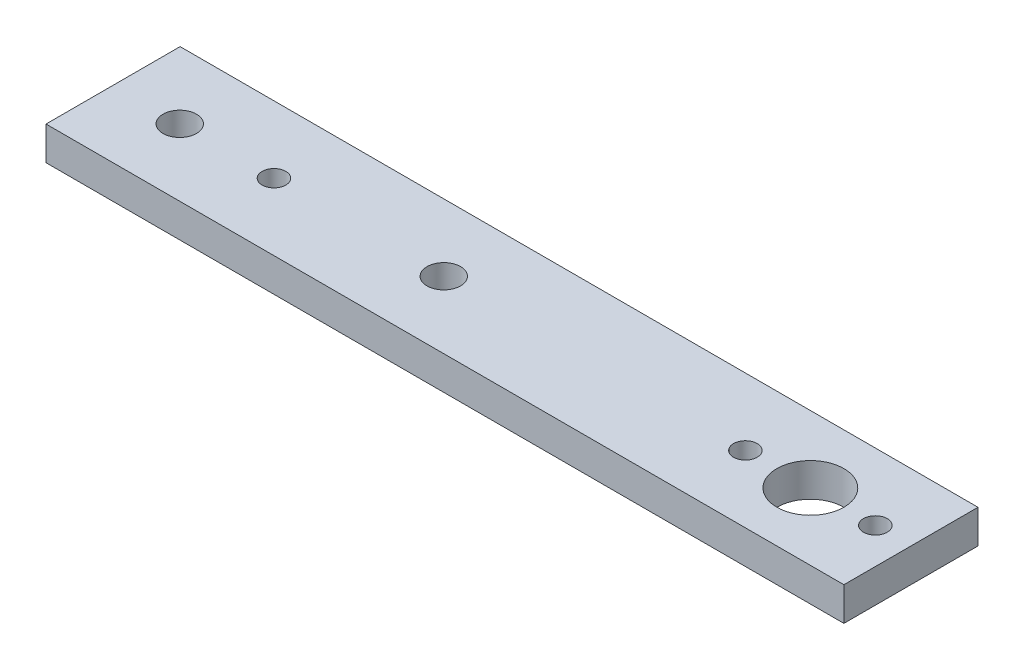
ISO-10303-21;
HEADER;
FILE_DESCRIPTION(('STEP AP214'),'2;1');
FILE_NAME('part.step','',(''),(''),'','','');
FILE_SCHEMA(('AUTOMOTIVE_DESIGN { 1 0 10303 214 1 1 1 1 }'));
ENDSEC;
DATA;
#1=APPLICATION_CONTEXT('core data for automotive mechanical design processes');
#2=APPLICATION_PROTOCOL_DEFINITION('international standard','automotive_design',2000,#1);
#3=PRODUCT_CONTEXT('',#1,'mechanical');
#4=PRODUCT('Part','Part','',(#3));
#5=PRODUCT_RELATED_PRODUCT_CATEGORY('part','',(#4));
#6=PRODUCT_DEFINITION_FORMATION('','',#4);
#7=PRODUCT_DEFINITION_CONTEXT('part definition',#1,'design');
#8=PRODUCT_DEFINITION('design','',#6,#7);
#9=PRODUCT_DEFINITION_SHAPE('','',#8);
#10=(LENGTH_UNIT() NAMED_UNIT(*) SI_UNIT(.MILLI.,.METRE.));
#11=(NAMED_UNIT(*) PLANE_ANGLE_UNIT() SI_UNIT($,.RADIAN.));
#12=(NAMED_UNIT(*) SI_UNIT($,.STERADIAN.) SOLID_ANGLE_UNIT());
#13=UNCERTAINTY_MEASURE_WITH_UNIT(LENGTH_MEASURE(1.E-05),#10,'distance_accuracy_value','');
#14=(GEOMETRIC_REPRESENTATION_CONTEXT(3) GLOBAL_UNCERTAINTY_ASSIGNED_CONTEXT((#13)) GLOBAL_UNIT_ASSIGNED_CONTEXT((#10,
#11,#12)) REPRESENTATION_CONTEXT('',''));
#15=CARTESIAN_POINT('',(0.,0.,0.));
#16=DIRECTION('',(0.,0.,1.));
#17=DIRECTION('',(1.,0.,0.));
#18=AXIS2_PLACEMENT_3D('',#15,#16,#17);
#19=CARTESIAN_POINT('',(0.,6.35,0.));
#20=DIRECTION('',(0.,1.,0.));
#21=DIRECTION('',(0.,0.,1.));
#22=AXIS2_PLACEMENT_3D('',#19,#20,#21);
#23=PLANE('',#22);
#24=CARTESIAN_POINT('',(28.1813,6.35,0.));
#25=DIRECTION('',(0.,-1.,0.));
#26=DIRECTION('',(0.,0.,-1.));
#27=AXIS2_PLACEMENT_3D('',#24,#25,#26);
#28=CIRCLE('',#27,2.2479);
#29=CARTESIAN_POINT('',(28.1813,6.35,-2.24789999999998));
#30=VERTEX_POINT('',#29);
#31=EDGE_CURVE('E312',#30,#30,#28,.T.);
#32=ORIENTED_EDGE('',*,*,#31,.T.);
#33=EDGE_LOOP('',(#32));
#34=FACE_BOUND('',#33,.T.);
#35=CARTESIAN_POINT('',(3.56869999999998,6.35,0.));
#36=DIRECTION('',(0.,-1.,0.));
#37=DIRECTION('',(0.,0.,-1.));
#38=AXIS2_PLACEMENT_3D('',#35,#36,#37);
#39=CIRCLE('',#38,2.2479);
#40=CARTESIAN_POINT('',(3.56869999999998,6.35,-2.24789999999998));
#41=VERTEX_POINT('',#40);
#42=EDGE_CURVE('E325',#41,#41,#39,.T.);
#43=ORIENTED_EDGE('',*,*,#42,.T.);
#44=EDGE_LOOP('',(#43));
#45=FACE_BOUND('',#44,.T.);
#46=CARTESIAN_POINT('',(-53.55992209,6.35,0.));
#47=DIRECTION('',(0.,-1.,0.));
#48=DIRECTION('',(0.,0.,-1.));
#49=AXIS2_PLACEMENT_3D('',#46,#47,#48);
#50=CIRCLE('',#49,3.17500000000001);
#51=CARTESIAN_POINT('',(-53.55992209,6.35,-3.17499999999999));
#52=VERTEX_POINT('',#51);
#53=EDGE_CURVE('E113',#52,#52,#50,.T.);
#54=ORIENTED_EDGE('',*,*,#53,.T.);
#55=EDGE_LOOP('',(#54));
#56=FACE_BOUND('',#55,.T.);
#57=CARTESIAN_POINT('',(-85.725,6.35,0.));
#58=DIRECTION('',(0.,-1.,0.));
#59=DIRECTION('',(0.,0.,-1.));
#60=AXIS2_PLACEMENT_3D('',#57,#58,#59);
#61=CIRCLE('',#60,2.24789999999999);
#62=CARTESIAN_POINT('',(-85.725,6.35,-2.2479));
#63=VERTEX_POINT('',#62);
#64=EDGE_CURVE('E303',#63,#63,#61,.T.);
#65=ORIENTED_EDGE('',*,*,#64,.T.);
#66=EDGE_LOOP('',(#65));
#67=FACE_BOUND('',#66,.T.);
#68=CARTESIAN_POINT('',(-103.5685508,6.35,0.));
#69=DIRECTION('',(0.,-1.,0.));
#70=DIRECTION('',(0.,0.,-1.));
#71=AXIS2_PLACEMENT_3D('',#68,#69,#70);
#72=CIRCLE('',#71,3.175);
#73=CARTESIAN_POINT('',(-103.5685508,6.35,-3.175));
#74=VERTEX_POINT('',#73);
#75=EDGE_CURVE('E297',#74,#74,#72,.T.);
#76=ORIENTED_EDGE('',*,*,#75,.T.);
#77=EDGE_LOOP('',(#76));
#78=FACE_BOUND('',#77,.T.);
#79=DIRECTION('',(0.,0.,-1.));
#80=VECTOR('',#79,1.);
#81=CARTESIAN_POINT('',(34.925,6.35,-12.7));
#82=LINE('',#81,#80);
#83=CARTESIAN_POINT('',(34.925,6.35,12.7));
#84=VERTEX_POINT('',#83);
#85=CARTESIAN_POINT('',(34.925,6.35,-12.7));
#86=VERTEX_POINT('',#85);
#87=EDGE_CURVE('E126',#84,#86,#82,.T.);
#88=ORIENTED_EDGE('',*,*,#87,.T.);
#89=DIRECTION('',(-1.,0.,0.));
#90=VECTOR('',#89,1.);
#91=CARTESIAN_POINT('',(-34.925,6.35,-12.7));
#92=LINE('',#91,#90);
#93=CARTESIAN_POINT('',(-116.205,6.34999999999999,-12.7));
#94=VERTEX_POINT('',#93);
#95=EDGE_CURVE('E88',#86,#94,#92,.T.);
#96=ORIENTED_EDGE('',*,*,#95,.T.);
#97=DIRECTION('',(0.,0.,-1.));
#98=VECTOR('',#97,1.);
#99=CARTESIAN_POINT('',(-116.205,6.34999999999999,12.7));
#100=LINE('',#99,#98);
#101=CARTESIAN_POINT('',(-116.205,6.34999999999999,12.7));
#102=VERTEX_POINT('',#101);
#103=EDGE_CURVE('E100',#102,#94,#100,.T.);
#104=ORIENTED_EDGE('',*,*,#103,.F.);
#105=DIRECTION('',(1.,0.,0.));
#106=VECTOR('',#105,1.);
#107=CARTESIAN_POINT('',(-34.925,6.35,12.7));
#108=LINE('',#107,#106);
#109=EDGE_CURVE('E63',#102,#84,#108,.T.);
#110=ORIENTED_EDGE('',*,*,#109,.T.);
#111=EDGE_LOOP('',(#88,#96,#104,#110));
#112=FACE_BOUND('',#111,.T.);
#113=CARTESIAN_POINT('',(15.875,6.35,0.));
#114=DIRECTION('',(0.,1.,0.));
#115=DIRECTION('',(0.,0.,1.));
#116=AXIS2_PLACEMENT_3D('',#113,#114,#115);
#117=CIRCLE('',#116,6.35);
#118=CARTESIAN_POINT('',(15.875,6.35,6.35000000000001));
#119=VERTEX_POINT('',#118);
#120=EDGE_CURVE('E117',#119,#119,#117,.T.);
#121=ORIENTED_EDGE('',*,*,#120,.F.);
#122=EDGE_LOOP('',(#121));
#123=FACE_BOUND('',#122,.T.);
#124=ADVANCED_FACE('F45',(#34,#45,#56,#67,#78,#112,#123),#23,.T.);
#125=CARTESIAN_POINT('',(0.,0.,0.));
#126=DIRECTION('',(0.,1.,0.));
#127=DIRECTION('',(0.,0.,1.));
#128=AXIS2_PLACEMENT_3D('',#125,#126,#127);
#129=PLANE('',#128);
#130=CARTESIAN_POINT('',(28.1813,0.,0.));
#131=DIRECTION('',(0.,-1.,0.));
#132=DIRECTION('',(0.,0.,-1.));
#133=AXIS2_PLACEMENT_3D('',#130,#131,#132);
#134=CIRCLE('',#133,2.2479);
#135=CARTESIAN_POINT('',(28.1813,0.,-2.24789999999998));
#136=VERTEX_POINT('',#135);
#137=EDGE_CURVE('E333',#136,#136,#134,.T.);
#138=ORIENTED_EDGE('',*,*,#137,.F.);
#139=EDGE_LOOP('',(#138));
#140=FACE_BOUND('',#139,.T.);
#141=CARTESIAN_POINT('',(3.56869999999998,0.,0.));
#142=DIRECTION('',(0.,-1.,0.));
#143=DIRECTION('',(0.,0.,-1.));
#144=AXIS2_PLACEMENT_3D('',#141,#142,#143);
#145=CIRCLE('',#144,2.2479);
#146=CARTESIAN_POINT('',(3.56869999999998,0.,-2.24789999999998));
#147=VERTEX_POINT('',#146);
#148=EDGE_CURVE('E329',#147,#147,#145,.T.);
#149=ORIENTED_EDGE('',*,*,#148,.F.);
#150=EDGE_LOOP('',(#149));
#151=FACE_BOUND('',#150,.T.);
#152=CARTESIAN_POINT('',(-53.55992209,0.,0.));
#153=DIRECTION('',(0.,-1.,0.));
#154=DIRECTION('',(0.,0.,-1.));
#155=AXIS2_PLACEMENT_3D('',#152,#153,#154);
#156=CIRCLE('',#155,3.17500000000001);
#157=CARTESIAN_POINT('',(-53.55992209,0.,-3.17499999999999));
#158=VERTEX_POINT('',#157);
#159=EDGE_CURVE('E318',#158,#158,#156,.T.);
#160=ORIENTED_EDGE('',*,*,#159,.F.);
#161=EDGE_LOOP('',(#160));
#162=FACE_BOUND('',#161,.T.);
#163=CARTESIAN_POINT('',(-85.725,0.,0.));
#164=DIRECTION('',(0.,-1.,0.));
#165=DIRECTION('',(0.,0.,-1.));
#166=AXIS2_PLACEMENT_3D('',#163,#164,#165);
#167=CIRCLE('',#166,2.24789999999999);
#168=CARTESIAN_POINT('',(-85.725,0.,-2.2479));
#169=VERTEX_POINT('',#168);
#170=EDGE_CURVE('E310',#169,#169,#167,.T.);
#171=ORIENTED_EDGE('',*,*,#170,.F.);
#172=EDGE_LOOP('',(#171));
#173=FACE_BOUND('',#172,.T.);
#174=CARTESIAN_POINT('',(-103.5685508,0.,0.));
#175=DIRECTION('',(0.,-1.,0.));
#176=DIRECTION('',(0.,0.,-1.));
#177=AXIS2_PLACEMENT_3D('',#174,#175,#176);
#178=CIRCLE('',#177,3.175);
#179=CARTESIAN_POINT('',(-103.5685508,0.,-3.175));
#180=VERTEX_POINT('',#179);
#181=EDGE_CURVE('E300',#180,#180,#178,.T.);
#182=ORIENTED_EDGE('',*,*,#181,.F.);
#183=EDGE_LOOP('',(#182));
#184=FACE_BOUND('',#183,.T.);
#185=DIRECTION('',(0.,0.,-1.));
#186=VECTOR('',#185,1.);
#187=CARTESIAN_POINT('',(34.925,0.,-12.7));
#188=LINE('',#187,#186);
#189=CARTESIAN_POINT('',(34.925,0.,12.7));
#190=VERTEX_POINT('',#189);
#191=CARTESIAN_POINT('',(34.925,0.,-12.7));
#192=VERTEX_POINT('',#191);
#193=EDGE_CURVE('E121',#190,#192,#188,.T.);
#194=ORIENTED_EDGE('',*,*,#193,.F.);
#195=DIRECTION('',(1.,0.,0.));
#196=VECTOR('',#195,1.);
#197=CARTESIAN_POINT('',(-34.925,0.,12.7));
#198=LINE('',#197,#196);
#199=CARTESIAN_POINT('',(-116.205,0.,12.7));
#200=VERTEX_POINT('',#199);
#201=EDGE_CURVE('E129',#200,#190,#198,.T.);
#202=ORIENTED_EDGE('',*,*,#201,.F.);
#203=DIRECTION('',(0.,0.,-1.));
#204=VECTOR('',#203,1.);
#205=CARTESIAN_POINT('',(-116.205,0.,12.7));
#206=LINE('',#205,#204);
#207=CARTESIAN_POINT('',(-116.205,0.,-12.7));
#208=VERTEX_POINT('',#207);
#209=EDGE_CURVE('E107',#200,#208,#206,.T.);
#210=ORIENTED_EDGE('',*,*,#209,.T.);
#211=DIRECTION('',(-1.,0.,0.));
#212=VECTOR('',#211,1.);
#213=CARTESIAN_POINT('',(-34.925,0.,-12.7));
#214=LINE('',#213,#212);
#215=EDGE_CURVE('E75',#192,#208,#214,.T.);
#216=ORIENTED_EDGE('',*,*,#215,.F.);
#217=EDGE_LOOP('',(#194,#202,#210,#216));
#218=FACE_BOUND('',#217,.T.);
#219=CARTESIAN_POINT('',(15.875,0.,0.));
#220=DIRECTION('',(0.,1.,0.));
#221=DIRECTION('',(0.,0.,1.));
#222=AXIS2_PLACEMENT_3D('',#219,#220,#221);
#223=CIRCLE('',#222,6.35);
#224=CARTESIAN_POINT('',(15.875,0.,6.35000000000001));
#225=VERTEX_POINT('',#224);
#226=EDGE_CURVE('E122',#225,#225,#223,.T.);
#227=ORIENTED_EDGE('',*,*,#226,.T.);
#228=EDGE_LOOP('',(#227));
#229=FACE_BOUND('',#228,.T.);
#230=ADVANCED_FACE('F143',(#140,#151,#162,#173,#184,#218,#229),#129,.F.);
#231=CARTESIAN_POINT('',(34.925,6.35,-12.7));
#232=DIRECTION('',(-1.,0.,0.));
#233=DIRECTION('',(0.,0.,1.));
#234=AXIS2_PLACEMENT_3D('',#231,#232,#233);
#235=PLANE('',#234);
#236=ORIENTED_EDGE('',*,*,#193,.T.);
#237=DIRECTION('',(0.,-1.,0.));
#238=VECTOR('',#237,1.);
#239=CARTESIAN_POINT('',(34.925,6.35,-12.7));
#240=LINE('',#239,#238);
#241=EDGE_CURVE('E11',#86,#192,#240,.T.);
#242=ORIENTED_EDGE('',*,*,#241,.F.);
#243=ORIENTED_EDGE('',*,*,#87,.F.);
#244=DIRECTION('',(0.,-1.,0.));
#245=VECTOR('',#244,1.);
#246=CARTESIAN_POINT('',(34.925,6.35,12.7));
#247=LINE('',#246,#245);
#248=EDGE_CURVE('E55',#84,#190,#247,.T.);
#249=ORIENTED_EDGE('',*,*,#248,.T.);
#250=EDGE_LOOP('',(#236,#242,#243,#249));
#251=FACE_BOUND('',#250,.T.);
#252=ADVANCED_FACE('F47',(#251),#235,.F.);
#253=CARTESIAN_POINT('',(-34.925,6.35,-12.7));
#254=DIRECTION('',(0.,0.,1.));
#255=DIRECTION('',(1.,0.,0.));
#256=AXIS2_PLACEMENT_3D('',#253,#254,#255);
#257=PLANE('',#256);
#258=ORIENTED_EDGE('',*,*,#215,.T.);
#259=DIRECTION('',(0.,-1.,0.));
#260=VECTOR('',#259,1.);
#261=CARTESIAN_POINT('',(-116.205,91.5063174403403,-12.7));
#262=LINE('',#261,#260);
#263=EDGE_CURVE('E104',#94,#208,#262,.T.);
#264=ORIENTED_EDGE('',*,*,#263,.F.);
#265=ORIENTED_EDGE('',*,*,#95,.F.);
#266=ORIENTED_EDGE('',*,*,#241,.T.);
#267=EDGE_LOOP('',(#258,#264,#265,#266));
#268=FACE_BOUND('',#267,.T.);
#269=ADVANCED_FACE('F160',(#268),#257,.F.);
#270=CARTESIAN_POINT('',(-34.925,6.35,12.7));
#271=DIRECTION('',(0.,0.,-1.));
#272=DIRECTION('',(-1.,0.,0.));
#273=AXIS2_PLACEMENT_3D('',#270,#271,#272);
#274=PLANE('',#273);
#275=ORIENTED_EDGE('',*,*,#201,.T.);
#276=ORIENTED_EDGE('',*,*,#248,.F.);
#277=ORIENTED_EDGE('',*,*,#109,.F.);
#278=DIRECTION('',(0.,-1.,0.));
#279=VECTOR('',#278,1.);
#280=CARTESIAN_POINT('',(-116.205,91.5063174403403,12.7));
#281=LINE('',#280,#279);
#282=EDGE_CURVE('E93',#102,#200,#281,.T.);
#283=ORIENTED_EDGE('',*,*,#282,.T.);
#284=EDGE_LOOP('',(#275,#276,#277,#283));
#285=FACE_BOUND('',#284,.T.);
#286=ADVANCED_FACE('F91',(#285),#274,.F.);
#287=CARTESIAN_POINT('',(15.875,6.35,0.));
#288=DIRECTION('',(0.,-1.,0.));
#289=DIRECTION('',(0.,0.,-1.));
#290=AXIS2_PLACEMENT_3D('',#287,#288,#289);
#291=CYLINDRICAL_SURFACE('',#290,6.35);
#292=ORIENTED_EDGE('',*,*,#120,.T.);
#293=EDGE_LOOP('',(#292));
#294=FACE_BOUND('',#293,.T.);
#295=ORIENTED_EDGE('',*,*,#226,.F.);
#296=EDGE_LOOP('',(#295));
#297=FACE_BOUND('',#296,.T.);
#298=ADVANCED_FACE('F150',(#294,#297),#291,.F.);
#299=CARTESIAN_POINT('',(-116.205,91.5063174403403,12.7));
#300=DIRECTION('',(-1.,0.,0.));
#301=DIRECTION('',(0.,0.,1.));
#302=AXIS2_PLACEMENT_3D('',#299,#300,#301);
#303=PLANE('',#302);
#304=ORIENTED_EDGE('',*,*,#282,.F.);
#305=ORIENTED_EDGE('',*,*,#103,.T.);
#306=ORIENTED_EDGE('',*,*,#263,.T.);
#307=ORIENTED_EDGE('',*,*,#209,.F.);
#308=EDGE_LOOP('',(#304,#305,#306,#307));
#309=FACE_BOUND('',#308,.T.);
#310=ADVANCED_FACE('F106',(#309),#303,.T.);
#311=CARTESIAN_POINT('',(-103.5685508,6.35,0.));
#312=DIRECTION('',(0.,-1.,0.));
#313=DIRECTION('',(0.,0.,-1.));
#314=AXIS2_PLACEMENT_3D('',#311,#312,#313);
#315=CYLINDRICAL_SURFACE('',#314,3.175);
#316=ORIENTED_EDGE('',*,*,#75,.F.);
#317=EDGE_LOOP('',(#316));
#318=FACE_BOUND('',#317,.T.);
#319=ORIENTED_EDGE('',*,*,#181,.T.);
#320=EDGE_LOOP('',(#319));
#321=FACE_BOUND('',#320,.T.);
#322=ADVANCED_FACE('F158',(#318,#321),#315,.F.);
#323=CARTESIAN_POINT('',(-85.725,6.35,0.));
#324=DIRECTION('',(0.,-1.,0.));
#325=DIRECTION('',(0.,0.,-1.));
#326=AXIS2_PLACEMENT_3D('',#323,#324,#325);
#327=CYLINDRICAL_SURFACE('',#326,2.24789999999999);
#328=ORIENTED_EDGE('',*,*,#64,.F.);
#329=EDGE_LOOP('',(#328));
#330=FACE_BOUND('',#329,.T.);
#331=ORIENTED_EDGE('',*,*,#170,.T.);
#332=EDGE_LOOP('',(#331));
#333=FACE_BOUND('',#332,.T.);
#334=ADVANCED_FACE('F218',(#330,#333),#327,.F.);
#335=CARTESIAN_POINT('',(-53.55992209,6.35,0.));
#336=DIRECTION('',(0.,-1.,0.));
#337=DIRECTION('',(0.,0.,-1.));
#338=AXIS2_PLACEMENT_3D('',#335,#336,#337);
#339=CYLINDRICAL_SURFACE('',#338,3.17500000000001);
#340=ORIENTED_EDGE('',*,*,#53,.F.);
#341=EDGE_LOOP('',(#340));
#342=FACE_BOUND('',#341,.T.);
#343=ORIENTED_EDGE('',*,*,#159,.T.);
#344=EDGE_LOOP('',(#343));
#345=FACE_BOUND('',#344,.T.);
#346=ADVANCED_FACE('F195',(#342,#345),#339,.F.);
#347=CARTESIAN_POINT('',(3.56869999999998,6.35,0.));
#348=DIRECTION('',(0.,-1.,0.));
#349=DIRECTION('',(0.,0.,-1.));
#350=AXIS2_PLACEMENT_3D('',#347,#348,#349);
#351=CYLINDRICAL_SURFACE('',#350,2.2479);
#352=ORIENTED_EDGE('',*,*,#42,.F.);
#353=EDGE_LOOP('',(#352));
#354=FACE_BOUND('',#353,.T.);
#355=ORIENTED_EDGE('',*,*,#148,.T.);
#356=EDGE_LOOP('',(#355));
#357=FACE_BOUND('',#356,.T.);
#358=ADVANCED_FACE('F189',(#354,#357),#351,.F.);
#359=CARTESIAN_POINT('',(28.1813,6.35,0.));
#360=DIRECTION('',(0.,-1.,0.));
#361=DIRECTION('',(0.,0.,-1.));
#362=AXIS2_PLACEMENT_3D('',#359,#360,#361);
#363=CYLINDRICAL_SURFACE('',#362,2.2479);
#364=ORIENTED_EDGE('',*,*,#31,.F.);
#365=EDGE_LOOP('',(#364));
#366=FACE_BOUND('',#365,.T.);
#367=ORIENTED_EDGE('',*,*,#137,.T.);
#368=EDGE_LOOP('',(#367));
#369=FACE_BOUND('',#368,.T.);
#370=ADVANCED_FACE('F194',(#366,#369),#363,.F.);
#371=CLOSED_SHELL('',(#124,#230,#252,#269,#286,#298,#310,#322,#334,#346,#358,#370));
#372=MANIFOLD_SOLID_BREP('B2',#371);
#373=ADVANCED_BREP_SHAPE_REPRESENTATION('',(#18,#372),#14);
#374=SHAPE_DEFINITION_REPRESENTATION(#9,#373);
ENDSEC;
END-ISO-10303-21;
